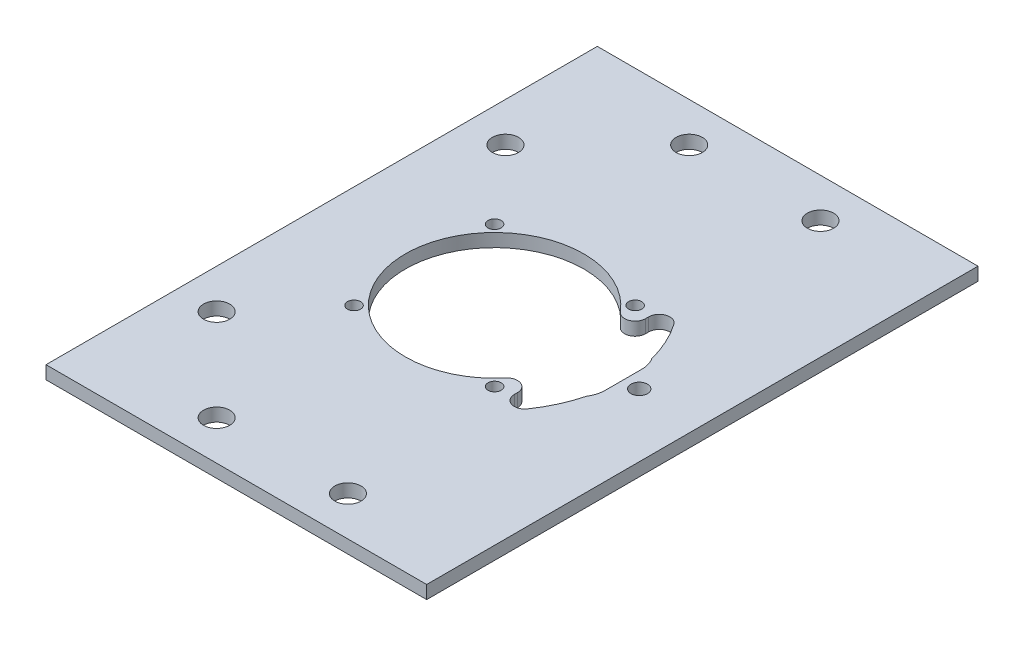
ISO-10303-21;
HEADER;
FILE_DESCRIPTION(('STEP AP214'),'2;1');
FILE_NAME('part.step','',(''),(''),'','','');
FILE_SCHEMA(('AUTOMOTIVE_DESIGN { 1 0 10303 214 1 1 1 1 }'));
ENDSEC;
DATA;
#1=APPLICATION_CONTEXT('core data for automotive mechanical design processes');
#2=APPLICATION_PROTOCOL_DEFINITION('international standard','automotive_design',2000,#1);
#3=PRODUCT_CONTEXT('',#1,'mechanical');
#4=PRODUCT('Part','Part','',(#3));
#5=PRODUCT_RELATED_PRODUCT_CATEGORY('part','',(#4));
#6=PRODUCT_DEFINITION_FORMATION('','',#4);
#7=PRODUCT_DEFINITION_CONTEXT('part definition',#1,'design');
#8=PRODUCT_DEFINITION('design','',#6,#7);
#9=PRODUCT_DEFINITION_SHAPE('','',#8);
#10=(LENGTH_UNIT() NAMED_UNIT(*) SI_UNIT(.MILLI.,.METRE.));
#11=(NAMED_UNIT(*) PLANE_ANGLE_UNIT() SI_UNIT($,.RADIAN.));
#12=(NAMED_UNIT(*) SI_UNIT($,.STERADIAN.) SOLID_ANGLE_UNIT());
#13=UNCERTAINTY_MEASURE_WITH_UNIT(LENGTH_MEASURE(1.E-05),#10,'distance_accuracy_value','');
#14=(GEOMETRIC_REPRESENTATION_CONTEXT(3) GLOBAL_UNCERTAINTY_ASSIGNED_CONTEXT((#13)) GLOBAL_UNIT_ASSIGNED_CONTEXT((#10,
#11,#12)) REPRESENTATION_CONTEXT('',''));
#15=CARTESIAN_POINT('',(0.,0.,0.));
#16=DIRECTION('',(0.,0.,1.));
#17=DIRECTION('',(1.,0.,0.));
#18=AXIS2_PLACEMENT_3D('',#15,#16,#17);
#19=CARTESIAN_POINT('',(0.,3.175,0.));
#20=DIRECTION('',(0.,-1.,0.));
#21=DIRECTION('',(0.,0.,-1.));
#22=AXIS2_PLACEMENT_3D('',#19,#20,#21);
#23=PLANE('',#22);
#24=DIRECTION('',(-0.00543717548561143,0.,0.999985218452122));
#25=VECTOR('',#24,1.);
#26=CARTESIAN_POINT('',(-32.3880138418583,3.175,16.24322424697));
#27=LINE('',#26,#25);
#28=CARTESIAN_POINT('',(-32.3839984355772,3.175,15.5047255654771));
#29=VERTEX_POINT('',#28);
#30=CARTESIAN_POINT('',(-32.3880138418583,3.175,16.24322424697));
#31=VERTEX_POINT('',#30);
#32=EDGE_CURVE('E195',#29,#31,#27,.T.);
#33=ORIENTED_EDGE('',*,*,#32,.F.);
#34=CARTESIAN_POINT('',(-34.9239608904456,3.175,15.4909151397437));
#35=DIRECTION('',(0.,-1.,0.));
#36=DIRECTION('',(0.,0.,-1.));
#37=AXIS2_PLACEMENT_3D('',#34,#35,#36);
#38=CIRCLE('',#37,2.54);
#39=CARTESIAN_POINT('',(-36.8714386914514,3.175,13.8602924934549));
#40=VERTEX_POINT('',#39);
#41=EDGE_CURVE('E445',#29,#40,#38,.F.);
#42=ORIENTED_EDGE('',*,*,#41,.T.);
#43=CARTESIAN_POINT('',(-53.425,3.175,0.));
#44=DIRECTION('',(0.,1.,0.));
#45=DIRECTION('',(0.,0.,1.));
#46=AXIS2_PLACEMENT_3D('',#43,#44,#45);
#47=CIRCLE('',#46,21.59);
#48=CARTESIAN_POINT('',(-36.8714386914514,3.175,-13.8602924934549));
#49=VERTEX_POINT('',#48);
#50=EDGE_CURVE('E375',#49,#40,#47,.T.);
#51=ORIENTED_EDGE('',*,*,#50,.F.);
#52=CARTESIAN_POINT('',(-34.9239608904456,3.175,-15.4909151397437));
#53=DIRECTION('',(0.,-1.,0.));
#54=DIRECTION('',(0.,0.,-1.));
#55=AXIS2_PLACEMENT_3D('',#52,#53,#54);
#56=CIRCLE('',#55,2.54);
#57=CARTESIAN_POINT('',(-32.3839984355773,3.175,-15.5047255654771));
#58=VERTEX_POINT('',#57);
#59=EDGE_CURVE('E442',#49,#58,#56,.F.);
#60=ORIENTED_EDGE('',*,*,#59,.T.);
#61=DIRECTION('',(0.00543717548561203,0.,0.999985218452122));
#62=VECTOR('',#61,1.);
#63=CARTESIAN_POINT('',(-32.3880138418583,3.175,-16.24322424697));
#64=LINE('',#63,#62);
#65=CARTESIAN_POINT('',(-32.3880138418583,3.175,-16.24322424697));
#66=VERTEX_POINT('',#65);
#67=EDGE_CURVE('E189',#66,#58,#64,.T.);
#68=ORIENTED_EDGE('',*,*,#67,.F.);
#69=CARTESIAN_POINT('',(-29.84805138699,3.175,-16.2570346727035));
#70=DIRECTION('',(0.,1.,0.));
#71=DIRECTION('',(0.,0.,1.));
#72=AXIS2_PLACEMENT_3D('',#69,#70,#71);
#73=CIRCLE('',#72,2.54);
#74=CARTESIAN_POINT('',(-27.7569694700933,3.175,-17.698900275604));
#75=VERTEX_POINT('',#74);
#76=EDGE_CURVE('E229',#75,#66,#73,.T.);
#77=ORIENTED_EDGE('',*,*,#76,.F.);
#78=CARTESIAN_POINT('',(-53.425,3.175,0.));
#79=DIRECTION('',(0.,1.,0.));
#80=DIRECTION('',(0.,0.,1.));
#81=AXIS2_PLACEMENT_3D('',#78,#79,#80);
#82=CIRCLE('',#81,31.1785);
#83=CARTESIAN_POINT('',(-23.2293271632066,3.175,-7.76660828053905));
#84=VERTEX_POINT('',#83);
#85=EDGE_CURVE('E225',#84,#75,#82,.T.);
#86=ORIENTED_EDGE('',*,*,#85,.F.);
#87=CARTESIAN_POINT('',(-25.190587694336,3.175,-6.15258934352685));
#88=DIRECTION('',(0.,-1.,0.));
#89=DIRECTION('',(0.,0.,-1.));
#90=AXIS2_PLACEMENT_3D('',#87,#88,#89);
#91=CIRCLE('',#90,2.54);
#92=CARTESIAN_POINT('',(-22.91997949056,3.175,-7.29098223921143));
#93=VERTEX_POINT('',#92);
#94=EDGE_CURVE('E428',#84,#93,#91,.T.);
#95=ORIENTED_EDGE('',*,*,#94,.T.);
#96=CARTESIAN_POINT('',(-28.5965,3.175,-4.44499999999999));
#97=DIRECTION('',(0.,1.,0.));
#98=DIRECTION('',(0.,0.,1.));
#99=AXIS2_PLACEMENT_3D('',#96,#97,#98);
#100=CIRCLE('',#99,6.35);
#101=CARTESIAN_POINT('',(-22.2465,3.175,-4.44499999999999));
#102=VERTEX_POINT('',#101);
#103=EDGE_CURVE('E248',#93,#102,#100,.F.);
#104=ORIENTED_EDGE('',*,*,#103,.T.);
#105=DIRECTION('',(0.,0.,1.));
#106=VECTOR('',#105,1.);
#107=CARTESIAN_POINT('',(-22.2465,3.175,0.));
#108=LINE('',#107,#106);
#109=CARTESIAN_POINT('',(-22.2465,3.175,4.44499999999998));
#110=VERTEX_POINT('',#109);
#111=EDGE_CURVE('E253',#102,#110,#108,.T.);
#112=ORIENTED_EDGE('',*,*,#111,.T.);
#113=CARTESIAN_POINT('',(-28.5965,3.175,4.44499999999998));
#114=DIRECTION('',(0.,1.,0.));
#115=DIRECTION('',(0.,0.,1.));
#116=AXIS2_PLACEMENT_3D('',#113,#114,#115);
#117=CIRCLE('',#116,6.35);
#118=CARTESIAN_POINT('',(-22.91997949056,3.175,7.29098223921142));
#119=VERTEX_POINT('',#118);
#120=EDGE_CURVE('E263',#110,#119,#117,.F.);
#121=ORIENTED_EDGE('',*,*,#120,.T.);
#122=CARTESIAN_POINT('',(-25.190587694336,3.175,6.15258934352686));
#123=DIRECTION('',(0.,-1.,0.));
#124=DIRECTION('',(0.,0.,-1.));
#125=AXIS2_PLACEMENT_3D('',#122,#123,#124);
#126=CIRCLE('',#125,2.54);
#127=CARTESIAN_POINT('',(-23.2293271632066,3.175,7.76660828053907));
#128=VERTEX_POINT('',#127);
#129=EDGE_CURVE('E421',#119,#128,#126,.T.);
#130=ORIENTED_EDGE('',*,*,#129,.T.);
#131=CARTESIAN_POINT('',(-27.7569694700933,3.175,17.698900275604));
#132=VERTEX_POINT('',#131);
#133=EDGE_CURVE('E226',#132,#128,#82,.T.);
#134=ORIENTED_EDGE('',*,*,#133,.F.);
#135=CARTESIAN_POINT('',(-29.8480513869899,3.175,16.2570346727035));
#136=DIRECTION('',(0.,1.,0.));
#137=DIRECTION('',(0.,0.,-1.));
#138=AXIS2_PLACEMENT_3D('',#135,#136,#137);
#139=CIRCLE('',#138,2.54);
#140=EDGE_CURVE('E222',#31,#132,#139,.T.);
#141=ORIENTED_EDGE('',*,*,#140,.F.);
#142=EDGE_LOOP('',(#33,#42,#51,#60,#68,#77,#86,#95,#104,#112,#121,#130,#134,#141));
#143=FACE_BOUND('',#142,.T.);
#144=DIRECTION('',(1.,0.,0.));
#145=VECTOR('',#144,1.);
#146=CARTESIAN_POINT('',(-95.25,3.175,66.675));
#147=LINE('',#146,#145);
#148=CARTESIAN_POINT('',(-95.25,3.175,66.675));
#149=VERTEX_POINT('',#148);
#150=CARTESIAN_POINT('',(-3.17499999999997,3.175,66.675));
#151=VERTEX_POINT('',#150);
#152=EDGE_CURVE('E391',#149,#151,#147,.T.);
#153=ORIENTED_EDGE('',*,*,#152,.T.);
#154=DIRECTION('',(0.,0.,1.));
#155=VECTOR('',#154,1.);
#156=CARTESIAN_POINT('',(-3.17499999999998,3.175,-66.675));
#157=LINE('',#156,#155);
#158=CARTESIAN_POINT('',(-3.17499999999998,3.175,-66.675));
#159=VERTEX_POINT('',#158);
#160=EDGE_CURVE('E321',#159,#151,#157,.T.);
#161=ORIENTED_EDGE('',*,*,#160,.F.);
#162=DIRECTION('',(1.,0.,0.));
#163=VECTOR('',#162,1.);
#164=CARTESIAN_POINT('',(-95.25,3.175,-66.675));
#165=LINE('',#164,#163);
#166=CARTESIAN_POINT('',(-95.25,3.175,-66.675));
#167=VERTEX_POINT('',#166);
#168=EDGE_CURVE('E386',#167,#159,#165,.T.);
#169=ORIENTED_EDGE('',*,*,#168,.F.);
#170=DIRECTION('',(0.,0.,-1.));
#171=VECTOR('',#170,1.);
#172=CARTESIAN_POINT('',(-95.25,3.175,66.675));
#173=LINE('',#172,#171);
#174=EDGE_CURVE('E382',#149,#167,#173,.T.);
#175=ORIENTED_EDGE('',*,*,#174,.F.);
#176=EDGE_LOOP('',(#153,#161,#169,#175));
#177=FACE_BOUND('',#176,.T.);
#178=CARTESIAN_POINT('',(-70.425,3.175,-17.));
#179=DIRECTION('',(0.,1.,0.));
#180=DIRECTION('',(0.,0.,1.));
#181=AXIS2_PLACEMENT_3D('',#178,#179,#180);
#182=CIRCLE('',#181,1.5875);
#183=CARTESIAN_POINT('',(-70.425,3.175,-15.4125));
#184=VERTEX_POINT('',#183);
#185=EDGE_CURVE('E352',#184,#184,#182,.T.);
#186=ORIENTED_EDGE('',*,*,#185,.F.);
#187=EDGE_LOOP('',(#186));
#188=FACE_BOUND('',#187,.T.);
#189=CARTESIAN_POINT('',(-36.425,3.175,-17.));
#190=DIRECTION('',(0.,1.,0.));
#191=DIRECTION('',(0.,0.,1.));
#192=AXIS2_PLACEMENT_3D('',#189,#190,#191);
#193=CIRCLE('',#192,1.5875);
#194=CARTESIAN_POINT('',(-36.425,3.175,-15.4125));
#195=VERTEX_POINT('',#194);
#196=EDGE_CURVE('E347',#195,#195,#193,.T.);
#197=ORIENTED_EDGE('',*,*,#196,.F.);
#198=EDGE_LOOP('',(#197));
#199=FACE_BOUND('',#198,.T.);
#200=CARTESIAN_POINT('',(-36.425,3.175,17.));
#201=DIRECTION('',(0.,1.,0.));
#202=DIRECTION('',(0.,0.,1.));
#203=AXIS2_PLACEMENT_3D('',#200,#201,#202);
#204=CIRCLE('',#203,1.5875);
#205=CARTESIAN_POINT('',(-36.425,3.175,18.5875));
#206=VERTEX_POINT('',#205);
#207=EDGE_CURVE('E348',#206,#206,#204,.T.);
#208=ORIENTED_EDGE('',*,*,#207,.F.);
#209=EDGE_LOOP('',(#208));
#210=FACE_BOUND('',#209,.T.);
#211=CARTESIAN_POINT('',(-70.425,3.175,17.));
#212=DIRECTION('',(0.,1.,0.));
#213=DIRECTION('',(0.,0.,1.));
#214=AXIS2_PLACEMENT_3D('',#211,#212,#213);
#215=CIRCLE('',#214,1.5875);
#216=CARTESIAN_POINT('',(-70.425,3.175,18.5875));
#217=VERTEX_POINT('',#216);
#218=EDGE_CURVE('E357',#217,#217,#215,.T.);
#219=ORIENTED_EDGE('',*,*,#218,.F.);
#220=EDGE_LOOP('',(#219));
#221=FACE_BOUND('',#220,.T.);
#222=CARTESIAN_POINT('',(-18.4365,3.175,0.));
#223=DIRECTION('',(0.,1.,0.));
#224=DIRECTION('',(0.,0.,1.));
#225=AXIS2_PLACEMENT_3D('',#222,#223,#224);
#226=CIRCLE('',#225,2.);
#227=CARTESIAN_POINT('',(-18.4365,3.175,2.));
#228=VERTEX_POINT('',#227);
#229=EDGE_CURVE('E335',#228,#228,#226,.T.);
#230=ORIENTED_EDGE('',*,*,#229,.F.);
#231=EDGE_LOOP('',(#230));
#232=FACE_BOUND('',#231,.T.);
#233=CARTESIAN_POINT('',(-63.5,3.175,57.15));
#234=DIRECTION('',(0.,1.,0.));
#235=DIRECTION('',(0.,0.,1.));
#236=AXIS2_PLACEMENT_3D('',#233,#234,#235);
#237=CIRCLE('',#236,3.175);
#238=CARTESIAN_POINT('',(-63.5,3.175,60.325));
#239=VERTEX_POINT('',#238);
#240=EDGE_CURVE('E289',#239,#239,#237,.T.);
#241=ORIENTED_EDGE('',*,*,#240,.F.);
#242=EDGE_LOOP('',(#241));
#243=FACE_BOUND('',#242,.T.);
#244=CARTESIAN_POINT('',(-63.5,3.175,-57.15));
#245=DIRECTION('',(0.,1.,0.));
#246=DIRECTION('',(0.,0.,-1.));
#247=AXIS2_PLACEMENT_3D('',#244,#245,#246);
#248=CIRCLE('',#247,3.175);
#249=CARTESIAN_POINT('',(-63.5,3.175,-60.325));
#250=VERTEX_POINT('',#249);
#251=EDGE_CURVE('E277',#250,#250,#248,.T.);
#252=ORIENTED_EDGE('',*,*,#251,.F.);
#253=EDGE_LOOP('',(#252));
#254=FACE_BOUND('',#253,.T.);
#255=CARTESIAN_POINT('',(-31.75,3.175,-57.15));
#256=DIRECTION('',(0.,1.,0.));
#257=DIRECTION('',(0.,0.,-1.));
#258=AXIS2_PLACEMENT_3D('',#255,#256,#257);
#259=CIRCLE('',#258,3.175);
#260=CARTESIAN_POINT('',(-31.75,3.175,-60.325));
#261=VERTEX_POINT('',#260);
#262=EDGE_CURVE('E310',#261,#261,#259,.T.);
#263=ORIENTED_EDGE('',*,*,#262,.F.);
#264=EDGE_LOOP('',(#263));
#265=FACE_BOUND('',#264,.T.);
#266=CARTESIAN_POINT('',(-85.725,3.175,-34.925));
#267=DIRECTION('',(0.,1.,0.));
#268=DIRECTION('',(0.,0.,-1.));
#269=AXIS2_PLACEMENT_3D('',#266,#267,#268);
#270=CIRCLE('',#269,3.175);
#271=CARTESIAN_POINT('',(-85.725,3.175,-38.1));
#272=VERTEX_POINT('',#271);
#273=EDGE_CURVE('E302',#272,#272,#270,.T.);
#274=ORIENTED_EDGE('',*,*,#273,.F.);
#275=EDGE_LOOP('',(#274));
#276=FACE_BOUND('',#275,.T.);
#277=CARTESIAN_POINT('',(-85.725,3.175,34.925));
#278=DIRECTION('',(0.,1.,0.));
#279=DIRECTION('',(0.,0.,1.));
#280=AXIS2_PLACEMENT_3D('',#277,#278,#279);
#281=CIRCLE('',#280,3.175);
#282=CARTESIAN_POINT('',(-85.725,3.175,38.1));
#283=VERTEX_POINT('',#282);
#284=EDGE_CURVE('E294',#283,#283,#281,.T.);
#285=ORIENTED_EDGE('',*,*,#284,.F.);
#286=EDGE_LOOP('',(#285));
#287=FACE_BOUND('',#286,.T.);
#288=CARTESIAN_POINT('',(-31.75,3.175,57.15));
#289=DIRECTION('',(0.,1.,0.));
#290=DIRECTION('',(0.,0.,1.));
#291=AXIS2_PLACEMENT_3D('',#288,#289,#290);
#292=CIRCLE('',#291,3.175);
#293=CARTESIAN_POINT('',(-31.75,3.175,60.325));
#294=VERTEX_POINT('',#293);
#295=EDGE_CURVE('E285',#294,#294,#292,.T.);
#296=ORIENTED_EDGE('',*,*,#295,.F.);
#297=EDGE_LOOP('',(#296));
#298=FACE_BOUND('',#297,.T.);
#299=ADVANCED_FACE('F49',(#143,#177,#188,#199,#210,#221,#232,#243,#254,#265,#276,#287,#298),#23,.F.);
#300=CARTESIAN_POINT('',(0.,0.,0.));
#301=DIRECTION('',(0.,-1.,0.));
#302=DIRECTION('',(0.,0.,-1.));
#303=AXIS2_PLACEMENT_3D('',#300,#301,#302);
#304=PLANE('',#303);
#305=CARTESIAN_POINT('',(-53.425,0.,0.));
#306=DIRECTION('',(0.,1.,0.));
#307=DIRECTION('',(0.,0.,1.));
#308=AXIS2_PLACEMENT_3D('',#305,#306,#307);
#309=CIRCLE('',#308,21.59);
#310=CARTESIAN_POINT('',(-36.8714386914514,0.,-13.8602924934549));
#311=VERTEX_POINT('',#310);
#312=CARTESIAN_POINT('',(-36.8714386914514,0.,13.8602924934549));
#313=VERTEX_POINT('',#312);
#314=EDGE_CURVE('E376',#311,#313,#309,.T.);
#315=ORIENTED_EDGE('',*,*,#314,.T.);
#316=CARTESIAN_POINT('',(-34.9239608904456,0.,15.4909151397437));
#317=DIRECTION('',(0.,-1.,0.));
#318=DIRECTION('',(0.,0.,-1.));
#319=AXIS2_PLACEMENT_3D('',#316,#317,#318);
#320=CIRCLE('',#319,2.54);
#321=CARTESIAN_POINT('',(-32.3839984355772,0.,15.5047255654771));
#322=VERTEX_POINT('',#321);
#323=EDGE_CURVE('E58',#313,#322,#320,.T.);
#324=ORIENTED_EDGE('',*,*,#323,.T.);
#325=DIRECTION('',(-0.00543717548561143,0.,0.999985218452122));
#326=VECTOR('',#325,1.);
#327=CARTESIAN_POINT('',(-32.3880138418583,0.,16.24322424697));
#328=LINE('',#327,#326);
#329=CARTESIAN_POINT('',(-32.3880138418583,0.,16.24322424697));
#330=VERTEX_POINT('',#329);
#331=EDGE_CURVE('E177',#322,#330,#328,.T.);
#332=ORIENTED_EDGE('',*,*,#331,.T.);
#333=CARTESIAN_POINT('',(-29.8480513869899,0.,16.2570346727035));
#334=DIRECTION('',(0.,1.,0.));
#335=DIRECTION('',(0.,0.,-1.));
#336=AXIS2_PLACEMENT_3D('',#333,#334,#335);
#337=CIRCLE('',#336,2.54);
#338=CARTESIAN_POINT('',(-27.7569694700933,0.,17.698900275604));
#339=VERTEX_POINT('',#338);
#340=EDGE_CURVE('E183',#330,#339,#337,.T.);
#341=ORIENTED_EDGE('',*,*,#340,.T.);
#342=CARTESIAN_POINT('',(-53.425,0.,0.));
#343=DIRECTION('',(0.,1.,0.));
#344=DIRECTION('',(0.,0.,1.));
#345=AXIS2_PLACEMENT_3D('',#342,#343,#344);
#346=CIRCLE('',#345,31.1785);
#347=CARTESIAN_POINT('',(-23.2293271632066,0.,7.76660828053905));
#348=VERTEX_POINT('',#347);
#349=EDGE_CURVE('E210',#339,#348,#346,.T.);
#350=ORIENTED_EDGE('',*,*,#349,.T.);
#351=CARTESIAN_POINT('',(-25.190587694336,0.,6.15258934352686));
#352=DIRECTION('',(0.,-1.,0.));
#353=DIRECTION('',(0.,0.,-1.));
#354=AXIS2_PLACEMENT_3D('',#351,#352,#353);
#355=CIRCLE('',#354,2.54);
#356=CARTESIAN_POINT('',(-22.91997949056,0.,7.29098223921142));
#357=VERTEX_POINT('',#356);
#358=EDGE_CURVE('E425',#348,#357,#355,.F.);
#359=ORIENTED_EDGE('',*,*,#358,.T.);
#360=CARTESIAN_POINT('',(-28.5965,0.,4.44499999999998));
#361=DIRECTION('',(0.,1.,0.));
#362=DIRECTION('',(0.,0.,1.));
#363=AXIS2_PLACEMENT_3D('',#360,#361,#362);
#364=CIRCLE('',#363,6.35);
#365=CARTESIAN_POINT('',(-22.2465,0.,4.44499999999998));
#366=VERTEX_POINT('',#365);
#367=EDGE_CURVE('E252',#366,#357,#364,.F.);
#368=ORIENTED_EDGE('',*,*,#367,.F.);
#369=DIRECTION('',(0.,0.,1.));
#370=VECTOR('',#369,1.);
#371=CARTESIAN_POINT('',(-22.2465,0.,0.));
#372=LINE('',#371,#370);
#373=CARTESIAN_POINT('',(-22.2465,0.,-4.44499999999999));
#374=VERTEX_POINT('',#373);
#375=EDGE_CURVE('E257',#374,#366,#372,.T.);
#376=ORIENTED_EDGE('',*,*,#375,.F.);
#377=CARTESIAN_POINT('',(-28.5965,0.,-4.44499999999999));
#378=DIRECTION('',(0.,1.,0.));
#379=DIRECTION('',(0.,0.,1.));
#380=AXIS2_PLACEMENT_3D('',#377,#378,#379);
#381=CIRCLE('',#380,6.35);
#382=CARTESIAN_POINT('',(-22.91997949056,0.,-7.29098223921143));
#383=VERTEX_POINT('',#382);
#384=EDGE_CURVE('E249',#383,#374,#381,.F.);
#385=ORIENTED_EDGE('',*,*,#384,.F.);
#386=CARTESIAN_POINT('',(-25.190587694336,0.,-6.15258934352685));
#387=DIRECTION('',(0.,-1.,0.));
#388=DIRECTION('',(0.,0.,-1.));
#389=AXIS2_PLACEMENT_3D('',#386,#387,#388);
#390=CIRCLE('',#389,2.54);
#391=CARTESIAN_POINT('',(-23.2293271632066,0.,-7.76660828053905));
#392=VERTEX_POINT('',#391);
#393=EDGE_CURVE('E431',#383,#392,#390,.F.);
#394=ORIENTED_EDGE('',*,*,#393,.T.);
#395=CARTESIAN_POINT('',(-27.7569694700933,0.,-17.698900275604));
#396=VERTEX_POINT('',#395);
#397=EDGE_CURVE('E206',#392,#396,#346,.T.);
#398=ORIENTED_EDGE('',*,*,#397,.T.);
#399=CARTESIAN_POINT('',(-29.84805138699,0.,-16.2570346727035));
#400=DIRECTION('',(0.,1.,0.));
#401=DIRECTION('',(0.,0.,1.));
#402=AXIS2_PLACEMENT_3D('',#399,#400,#401);
#403=CIRCLE('',#402,2.54);
#404=CARTESIAN_POINT('',(-32.3880138418583,0.,-16.24322424697));
#405=VERTEX_POINT('',#404);
#406=EDGE_CURVE('E214',#396,#405,#403,.T.);
#407=ORIENTED_EDGE('',*,*,#406,.T.);
#408=DIRECTION('',(0.00543717548561203,0.,0.999985218452122));
#409=VECTOR('',#408,1.);
#410=CARTESIAN_POINT('',(-32.3880138418583,0.,-16.24322424697));
#411=LINE('',#410,#409);
#412=CARTESIAN_POINT('',(-32.3839984355773,0.,-15.5047255654771));
#413=VERTEX_POINT('',#412);
#414=EDGE_CURVE('E201',#405,#413,#411,.T.);
#415=ORIENTED_EDGE('',*,*,#414,.T.);
#416=CARTESIAN_POINT('',(-34.9239608904456,0.,-15.4909151397437));
#417=DIRECTION('',(0.,-1.,0.));
#418=DIRECTION('',(0.,0.,-1.));
#419=AXIS2_PLACEMENT_3D('',#416,#417,#418);
#420=CIRCLE('',#419,2.54);
#421=EDGE_CURVE('E454',#413,#311,#420,.T.);
#422=ORIENTED_EDGE('',*,*,#421,.T.);
#423=EDGE_LOOP('',(#315,#324,#332,#341,#350,#359,#368,#376,#385,#394,#398,#407,#415,#422));
#424=FACE_BOUND('',#423,.T.);
#425=CARTESIAN_POINT('',(-31.75,0.,57.15));
#426=DIRECTION('',(0.,1.,0.));
#427=DIRECTION('',(0.,0.,1.));
#428=AXIS2_PLACEMENT_3D('',#425,#426,#427);
#429=CIRCLE('',#428,3.175);
#430=CARTESIAN_POINT('',(-31.75,0.,60.325));
#431=VERTEX_POINT('',#430);
#432=EDGE_CURVE('E290',#431,#431,#429,.T.);
#433=ORIENTED_EDGE('',*,*,#432,.T.);
#434=EDGE_LOOP('',(#433));
#435=FACE_BOUND('',#434,.T.);
#436=CARTESIAN_POINT('',(-85.725,0.,34.925));
#437=DIRECTION('',(0.,1.,0.));
#438=DIRECTION('',(0.,0.,1.));
#439=AXIS2_PLACEMENT_3D('',#436,#437,#438);
#440=CIRCLE('',#439,3.175);
#441=CARTESIAN_POINT('',(-85.725,0.,38.1));
#442=VERTEX_POINT('',#441);
#443=EDGE_CURVE('E298',#442,#442,#440,.T.);
#444=ORIENTED_EDGE('',*,*,#443,.T.);
#445=EDGE_LOOP('',(#444));
#446=FACE_BOUND('',#445,.T.);
#447=CARTESIAN_POINT('',(-85.725,0.,-34.925));
#448=DIRECTION('',(0.,1.,0.));
#449=DIRECTION('',(0.,0.,-1.));
#450=AXIS2_PLACEMENT_3D('',#447,#448,#449);
#451=CIRCLE('',#450,3.175);
#452=CARTESIAN_POINT('',(-85.725,0.,-38.1));
#453=VERTEX_POINT('',#452);
#454=EDGE_CURVE('E306',#453,#453,#451,.T.);
#455=ORIENTED_EDGE('',*,*,#454,.T.);
#456=EDGE_LOOP('',(#455));
#457=FACE_BOUND('',#456,.T.);
#458=CARTESIAN_POINT('',(-31.75,0.,-57.15));
#459=DIRECTION('',(0.,1.,0.));
#460=DIRECTION('',(0.,0.,-1.));
#461=AXIS2_PLACEMENT_3D('',#458,#459,#460);
#462=CIRCLE('',#461,3.175);
#463=CARTESIAN_POINT('',(-31.75,0.,-60.325));
#464=VERTEX_POINT('',#463);
#465=EDGE_CURVE('E281',#464,#464,#462,.T.);
#466=ORIENTED_EDGE('',*,*,#465,.T.);
#467=EDGE_LOOP('',(#466));
#468=FACE_BOUND('',#467,.T.);
#469=CARTESIAN_POINT('',(-63.5,0.,-57.15));
#470=DIRECTION('',(0.,1.,0.));
#471=DIRECTION('',(0.,0.,-1.));
#472=AXIS2_PLACEMENT_3D('',#469,#470,#471);
#473=CIRCLE('',#472,3.175);
#474=CARTESIAN_POINT('',(-63.5,0.,-60.325));
#475=VERTEX_POINT('',#474);
#476=EDGE_CURVE('E273',#475,#475,#473,.T.);
#477=ORIENTED_EDGE('',*,*,#476,.T.);
#478=EDGE_LOOP('',(#477));
#479=FACE_BOUND('',#478,.T.);
#480=CARTESIAN_POINT('',(-63.5,0.,57.15));
#481=DIRECTION('',(0.,1.,0.));
#482=DIRECTION('',(0.,0.,1.));
#483=AXIS2_PLACEMENT_3D('',#480,#481,#482);
#484=CIRCLE('',#483,3.175);
#485=CARTESIAN_POINT('',(-63.5,0.,60.325));
#486=VERTEX_POINT('',#485);
#487=EDGE_CURVE('E317',#486,#486,#484,.T.);
#488=ORIENTED_EDGE('',*,*,#487,.T.);
#489=EDGE_LOOP('',(#488));
#490=FACE_BOUND('',#489,.T.);
#491=DIRECTION('',(0.,0.,1.));
#492=VECTOR('',#491,1.);
#493=CARTESIAN_POINT('',(-3.17499999999998,0.,-66.675));
#494=LINE('',#493,#492);
#495=CARTESIAN_POINT('',(-3.17499999999998,0.,-66.675));
#496=VERTEX_POINT('',#495);
#497=CARTESIAN_POINT('',(-3.17499999999997,0.,66.675));
#498=VERTEX_POINT('',#497);
#499=EDGE_CURVE('E325',#496,#498,#494,.T.);
#500=ORIENTED_EDGE('',*,*,#499,.T.);
#501=DIRECTION('',(1.,0.,0.));
#502=VECTOR('',#501,1.);
#503=CARTESIAN_POINT('',(-95.25,0.,66.675));
#504=LINE('',#503,#502);
#505=CARTESIAN_POINT('',(-95.25,0.,66.675));
#506=VERTEX_POINT('',#505);
#507=EDGE_CURVE('E387',#506,#498,#504,.T.);
#508=ORIENTED_EDGE('',*,*,#507,.F.);
#509=DIRECTION('',(0.,0.,-1.));
#510=VECTOR('',#509,1.);
#511=CARTESIAN_POINT('',(-95.25,0.,66.675));
#512=LINE('',#511,#510);
#513=CARTESIAN_POINT('',(-95.25,0.,-66.675));
#514=VERTEX_POINT('',#513);
#515=EDGE_CURVE('E379',#506,#514,#512,.T.);
#516=ORIENTED_EDGE('',*,*,#515,.T.);
#517=DIRECTION('',(1.,0.,0.));
#518=VECTOR('',#517,1.);
#519=CARTESIAN_POINT('',(-95.25,0.,-66.675));
#520=LINE('',#519,#518);
#521=EDGE_CURVE('E399',#514,#496,#520,.T.);
#522=ORIENTED_EDGE('',*,*,#521,.T.);
#523=EDGE_LOOP('',(#500,#508,#516,#522));
#524=FACE_BOUND('',#523,.T.);
#525=CARTESIAN_POINT('',(-18.4365,0.,0.));
#526=DIRECTION('',(0.,-1.,0.));
#527=DIRECTION('',(0.,0.,-1.));
#528=AXIS2_PLACEMENT_3D('',#525,#526,#527);
#529=CIRCLE('',#528,2.);
#530=CARTESIAN_POINT('',(-18.4365,0.,-2.));
#531=VERTEX_POINT('',#530);
#532=EDGE_CURVE('E342',#531,#531,#529,.T.);
#533=ORIENTED_EDGE('',*,*,#532,.F.);
#534=EDGE_LOOP('',(#533));
#535=FACE_BOUND('',#534,.T.);
#536=CARTESIAN_POINT('',(-70.425,0.,17.));
#537=DIRECTION('',(0.,-1.,0.));
#538=DIRECTION('',(0.,0.,-1.));
#539=AXIS2_PLACEMENT_3D('',#536,#537,#538);
#540=CIRCLE('',#539,1.5875);
#541=CARTESIAN_POINT('',(-70.425,0.,15.4125));
#542=VERTEX_POINT('',#541);
#543=EDGE_CURVE('E361',#542,#542,#540,.F.);
#544=ORIENTED_EDGE('',*,*,#543,.T.);
#545=EDGE_LOOP('',(#544));
#546=FACE_BOUND('',#545,.T.);
#547=CARTESIAN_POINT('',(-36.425,0.,17.));
#548=DIRECTION('',(0.,-1.,0.));
#549=DIRECTION('',(0.,0.,-1.));
#550=AXIS2_PLACEMENT_3D('',#547,#548,#549);
#551=CIRCLE('',#550,1.5875);
#552=CARTESIAN_POINT('',(-36.425,0.,15.4125));
#553=VERTEX_POINT('',#552);
#554=EDGE_CURVE('E353',#553,#553,#551,.F.);
#555=ORIENTED_EDGE('',*,*,#554,.T.);
#556=EDGE_LOOP('',(#555));
#557=FACE_BOUND('',#556,.T.);
#558=CARTESIAN_POINT('',(-36.425,0.,-17.));
#559=DIRECTION('',(0.,-1.,0.));
#560=DIRECTION('',(0.,0.,-1.));
#561=AXIS2_PLACEMENT_3D('',#558,#559,#560);
#562=CIRCLE('',#561,1.5875);
#563=CARTESIAN_POINT('',(-36.425,0.,-18.5875));
#564=VERTEX_POINT('',#563);
#565=EDGE_CURVE('E343',#564,#564,#562,.F.);
#566=ORIENTED_EDGE('',*,*,#565,.T.);
#567=EDGE_LOOP('',(#566));
#568=FACE_BOUND('',#567,.T.);
#569=CARTESIAN_POINT('',(-70.425,0.,-17.));
#570=DIRECTION('',(0.,-1.,0.));
#571=DIRECTION('',(0.,0.,-1.));
#572=AXIS2_PLACEMENT_3D('',#569,#570,#571);
#573=CIRCLE('',#572,1.5875);
#574=CARTESIAN_POINT('',(-70.425,0.,-18.5875));
#575=VERTEX_POINT('',#574);
#576=EDGE_CURVE('E371',#575,#575,#573,.F.);
#577=ORIENTED_EDGE('',*,*,#576,.T.);
#578=EDGE_LOOP('',(#577));
#579=FACE_BOUND('',#578,.T.);
#580=ADVANCED_FACE('F179',(#424,#435,#446,#457,#468,#479,#490,#524,#535,#546,#557,#568,#579),
#304,.T.);
#581=CARTESIAN_POINT('',(-53.425,0.,0.));
#582=DIRECTION('',(0.,1.,0.));
#583=DIRECTION('',(0.,0.,1.));
#584=AXIS2_PLACEMENT_3D('',#581,#582,#583);
#585=CYLINDRICAL_SURFACE('',#584,21.59);
#586=ORIENTED_EDGE('',*,*,#50,.T.);
#587=DIRECTION('',(0.,1.,0.));
#588=VECTOR('',#587,1.);
#589=CARTESIAN_POINT('',(-36.8714386914514,0.,13.8602924934549));
#590=LINE('',#589,#588);
#591=EDGE_CURVE('E71',#40,#313,#590,.F.);
#592=ORIENTED_EDGE('',*,*,#591,.T.);
#593=ORIENTED_EDGE('',*,*,#314,.F.);
#594=DIRECTION('',(0.,1.,0.));
#595=VECTOR('',#594,1.);
#596=CARTESIAN_POINT('',(-36.8714386914514,0.,-13.8602924934549));
#597=LINE('',#596,#595);
#598=EDGE_CURVE('E448',#311,#49,#597,.T.);
#599=ORIENTED_EDGE('',*,*,#598,.T.);
#600=EDGE_LOOP('',(#586,#592,#593,#599));
#601=FACE_BOUND('',#600,.T.);
#602=ADVANCED_FACE('F460',(#601),#585,.F.);
#603=CARTESIAN_POINT('',(-95.25,3.175,66.675));
#604=DIRECTION('',(-1.,0.,0.));
#605=DIRECTION('',(0.,0.,1.));
#606=AXIS2_PLACEMENT_3D('',#603,#604,#605);
#607=PLANE('',#606);
#608=ORIENTED_EDGE('',*,*,#515,.F.);
#609=DIRECTION('',(0.,-1.,0.));
#610=VECTOR('',#609,1.);
#611=CARTESIAN_POINT('',(-95.25,3.175,66.675));
#612=LINE('',#611,#610);
#613=EDGE_CURVE('E406',#149,#506,#612,.T.);
#614=ORIENTED_EDGE('',*,*,#613,.F.);
#615=ORIENTED_EDGE('',*,*,#174,.T.);
#616=DIRECTION('',(0.,-1.,0.));
#617=VECTOR('',#616,1.);
#618=CARTESIAN_POINT('',(-95.25,3.175,-66.675));
#619=LINE('',#618,#617);
#620=EDGE_CURVE('E395',#167,#514,#619,.T.);
#621=ORIENTED_EDGE('',*,*,#620,.T.);
#622=EDGE_LOOP('',(#608,#614,#615,#621));
#623=FACE_BOUND('',#622,.T.);
#624=ADVANCED_FACE('F521',(#623),#607,.T.);
#625=CARTESIAN_POINT('',(-95.25,3.175,66.675));
#626=DIRECTION('',(0.,0.,-1.));
#627=DIRECTION('',(-1.,0.,0.));
#628=AXIS2_PLACEMENT_3D('',#625,#626,#627);
#629=PLANE('',#628);
#630=ORIENTED_EDGE('',*,*,#507,.T.);
#631=DIRECTION('',(0.,1.,0.));
#632=VECTOR('',#631,1.);
#633=CARTESIAN_POINT('',(-3.17499999999997,0.,66.675));
#634=LINE('',#633,#632);
#635=EDGE_CURVE('E329',#498,#151,#634,.T.);
#636=ORIENTED_EDGE('',*,*,#635,.T.);
#637=ORIENTED_EDGE('',*,*,#152,.F.);
#638=ORIENTED_EDGE('',*,*,#613,.T.);
#639=EDGE_LOOP('',(#630,#636,#637,#638));
#640=FACE_BOUND('',#639,.T.);
#641=ADVANCED_FACE('F517',(#640),#629,.F.);
#642=CARTESIAN_POINT('',(-95.25,3.175,-66.675));
#643=DIRECTION('',(0.,0.,-1.));
#644=DIRECTION('',(-1.,0.,0.));
#645=AXIS2_PLACEMENT_3D('',#642,#643,#644);
#646=PLANE('',#645);
#647=DIRECTION('',(0.,1.,0.));
#648=VECTOR('',#647,1.);
#649=CARTESIAN_POINT('',(-3.17499999999998,0.,-66.675));
#650=LINE('',#649,#648);
#651=EDGE_CURVE('E332',#496,#159,#650,.T.);
#652=ORIENTED_EDGE('',*,*,#651,.F.);
#653=ORIENTED_EDGE('',*,*,#521,.F.);
#654=ORIENTED_EDGE('',*,*,#620,.F.);
#655=ORIENTED_EDGE('',*,*,#168,.T.);
#656=EDGE_LOOP('',(#652,#653,#654,#655));
#657=FACE_BOUND('',#656,.T.);
#658=ADVANCED_FACE('F520',(#657),#646,.T.);
#659=CARTESIAN_POINT('',(-70.425,-4.49012806053458,-17.));
#660=DIRECTION('',(0.,1.,0.));
#661=DIRECTION('',(0.,0.,1.));
#662=AXIS2_PLACEMENT_3D('',#659,#660,#661);
#663=CYLINDRICAL_SURFACE('',#662,1.5875);
#664=ORIENTED_EDGE('',*,*,#185,.T.);
#665=EDGE_LOOP('',(#664));
#666=FACE_BOUND('',#665,.T.);
#667=ORIENTED_EDGE('',*,*,#576,.F.);
#668=EDGE_LOOP('',(#667));
#669=FACE_BOUND('',#668,.T.);
#670=ADVANCED_FACE('F525',(#666,#669),#663,.F.);
#671=CARTESIAN_POINT('',(-36.425,-4.49012806053458,-17.));
#672=DIRECTION('',(0.,1.,0.));
#673=DIRECTION('',(0.,0.,1.));
#674=AXIS2_PLACEMENT_3D('',#671,#672,#673);
#675=CYLINDRICAL_SURFACE('',#674,1.5875);
#676=ORIENTED_EDGE('',*,*,#196,.T.);
#677=EDGE_LOOP('',(#676));
#678=FACE_BOUND('',#677,.T.);
#679=ORIENTED_EDGE('',*,*,#565,.F.);
#680=EDGE_LOOP('',(#679));
#681=FACE_BOUND('',#680,.T.);
#682=ADVANCED_FACE('F587',(#678,#681),#675,.F.);
#683=CARTESIAN_POINT('',(-36.425,-4.49012806053458,17.));
#684=DIRECTION('',(0.,1.,0.));
#685=DIRECTION('',(0.,0.,1.));
#686=AXIS2_PLACEMENT_3D('',#683,#684,#685);
#687=CYLINDRICAL_SURFACE('',#686,1.5875);
#688=ORIENTED_EDGE('',*,*,#207,.T.);
#689=EDGE_LOOP('',(#688));
#690=FACE_BOUND('',#689,.T.);
#691=ORIENTED_EDGE('',*,*,#554,.F.);
#692=EDGE_LOOP('',(#691));
#693=FACE_BOUND('',#692,.T.);
#694=ADVANCED_FACE('F590',(#690,#693),#687,.F.);
#695=CARTESIAN_POINT('',(-70.425,-4.49012806053458,17.));
#696=DIRECTION('',(0.,1.,0.));
#697=DIRECTION('',(0.,0.,1.));
#698=AXIS2_PLACEMENT_3D('',#695,#696,#697);
#699=CYLINDRICAL_SURFACE('',#698,1.5875);
#700=ORIENTED_EDGE('',*,*,#218,.T.);
#701=EDGE_LOOP('',(#700));
#702=FACE_BOUND('',#701,.T.);
#703=ORIENTED_EDGE('',*,*,#543,.F.);
#704=EDGE_LOOP('',(#703));
#705=FACE_BOUND('',#704,.T.);
#706=ADVANCED_FACE('F585',(#702,#705),#699,.F.);
#707=CARTESIAN_POINT('',(-18.4365,-6.825,0.));
#708=DIRECTION('',(0.,1.,0.));
#709=DIRECTION('',(0.,0.,1.));
#710=AXIS2_PLACEMENT_3D('',#707,#708,#709);
#711=CYLINDRICAL_SURFACE('',#710,2.);
#712=ORIENTED_EDGE('',*,*,#532,.T.);
#713=EDGE_LOOP('',(#712));
#714=FACE_BOUND('',#713,.T.);
#715=ORIENTED_EDGE('',*,*,#229,.T.);
#716=EDGE_LOOP('',(#715));
#717=FACE_BOUND('',#716,.T.);
#718=ADVANCED_FACE('F581',(#714,#717),#711,.F.);
#719=CARTESIAN_POINT('',(-3.17499999999998,0.,-66.675));
#720=DIRECTION('',(-1.,0.,0.));
#721=DIRECTION('',(0.,0.,1.));
#722=AXIS2_PLACEMENT_3D('',#719,#720,#721);
#723=PLANE('',#722);
#724=ORIENTED_EDGE('',*,*,#160,.T.);
#725=ORIENTED_EDGE('',*,*,#635,.F.);
#726=ORIENTED_EDGE('',*,*,#499,.F.);
#727=ORIENTED_EDGE('',*,*,#651,.T.);
#728=EDGE_LOOP('',(#724,#725,#726,#727));
#729=FACE_BOUND('',#728,.T.);
#730=ADVANCED_FACE('F577',(#729),#723,.F.);
#731=CARTESIAN_POINT('',(-63.5,0.,57.15));
#732=DIRECTION('',(0.,1.,0.));
#733=DIRECTION('',(0.,0.,1.));
#734=AXIS2_PLACEMENT_3D('',#731,#732,#733);
#735=CYLINDRICAL_SURFACE('',#734,3.175);
#736=ORIENTED_EDGE('',*,*,#487,.F.);
#737=EDGE_LOOP('',(#736));
#738=FACE_BOUND('',#737,.T.);
#739=ORIENTED_EDGE('',*,*,#240,.T.);
#740=EDGE_LOOP('',(#739));
#741=FACE_BOUND('',#740,.T.);
#742=ADVANCED_FACE('F559',(#738,#741),#735,.F.);
#743=CARTESIAN_POINT('',(-63.5,0.,-57.15));
#744=DIRECTION('',(0.,1.,0.));
#745=DIRECTION('',(0.,0.,1.));
#746=AXIS2_PLACEMENT_3D('',#743,#744,#745);
#747=CYLINDRICAL_SURFACE('',#746,3.175);
#748=ORIENTED_EDGE('',*,*,#476,.F.);
#749=EDGE_LOOP('',(#748));
#750=FACE_BOUND('',#749,.T.);
#751=ORIENTED_EDGE('',*,*,#251,.T.);
#752=EDGE_LOOP('',(#751));
#753=FACE_BOUND('',#752,.T.);
#754=ADVANCED_FACE('F555',(#750,#753),#747,.F.);
#755=CARTESIAN_POINT('',(-31.75,0.,-57.15));
#756=DIRECTION('',(0.,1.,0.));
#757=DIRECTION('',(0.,0.,1.));
#758=AXIS2_PLACEMENT_3D('',#755,#756,#757);
#759=CYLINDRICAL_SURFACE('',#758,3.175);
#760=ORIENTED_EDGE('',*,*,#465,.F.);
#761=EDGE_LOOP('',(#760));
#762=FACE_BOUND('',#761,.T.);
#763=ORIENTED_EDGE('',*,*,#262,.T.);
#764=EDGE_LOOP('',(#763));
#765=FACE_BOUND('',#764,.T.);
#766=ADVANCED_FACE('F558',(#762,#765),#759,.F.);
#767=CARTESIAN_POINT('',(-85.725,0.,-34.925));
#768=DIRECTION('',(0.,1.,0.));
#769=DIRECTION('',(0.,0.,1.));
#770=AXIS2_PLACEMENT_3D('',#767,#768,#769);
#771=CYLINDRICAL_SURFACE('',#770,3.175);
#772=ORIENTED_EDGE('',*,*,#454,.F.);
#773=EDGE_LOOP('',(#772));
#774=FACE_BOUND('',#773,.T.);
#775=ORIENTED_EDGE('',*,*,#273,.T.);
#776=EDGE_LOOP('',(#775));
#777=FACE_BOUND('',#776,.T.);
#778=ADVANCED_FACE('F567',(#774,#777),#771,.F.);
#779=CARTESIAN_POINT('',(-85.725,0.,34.925));
#780=DIRECTION('',(0.,1.,0.));
#781=DIRECTION('',(0.,0.,1.));
#782=AXIS2_PLACEMENT_3D('',#779,#780,#781);
#783=CYLINDRICAL_SURFACE('',#782,3.175);
#784=ORIENTED_EDGE('',*,*,#443,.F.);
#785=EDGE_LOOP('',(#784));
#786=FACE_BOUND('',#785,.T.);
#787=ORIENTED_EDGE('',*,*,#284,.T.);
#788=EDGE_LOOP('',(#787));
#789=FACE_BOUND('',#788,.T.);
#790=ADVANCED_FACE('F563',(#786,#789),#783,.F.);
#791=CARTESIAN_POINT('',(-31.75,0.,57.15));
#792=DIRECTION('',(0.,1.,0.));
#793=DIRECTION('',(0.,0.,1.));
#794=AXIS2_PLACEMENT_3D('',#791,#792,#793);
#795=CYLINDRICAL_SURFACE('',#794,3.175);
#796=ORIENTED_EDGE('',*,*,#432,.F.);
#797=EDGE_LOOP('',(#796));
#798=FACE_BOUND('',#797,.T.);
#799=ORIENTED_EDGE('',*,*,#295,.T.);
#800=EDGE_LOOP('',(#799));
#801=FACE_BOUND('',#800,.T.);
#802=ADVANCED_FACE('F554',(#798,#801),#795,.F.);
#803=CARTESIAN_POINT('',(-28.5965,0.,-4.44499999999999));
#804=DIRECTION('',(0.,1.,0.));
#805=DIRECTION('',(0.,0.,1.));
#806=AXIS2_PLACEMENT_3D('',#803,#804,#805);
#807=CYLINDRICAL_SURFACE('',#806,6.35);
#808=ORIENTED_EDGE('',*,*,#103,.F.);
#809=DIRECTION('',(0.,1.,0.));
#810=VECTOR('',#809,1.);
#811=CARTESIAN_POINT('',(-22.91997949056,0.,-7.29098223921143));
#812=LINE('',#811,#810);
#813=EDGE_CURVE('E418',#93,#383,#812,.F.);
#814=ORIENTED_EDGE('',*,*,#813,.T.);
#815=ORIENTED_EDGE('',*,*,#384,.T.);
#816=DIRECTION('',(0.,1.,0.));
#817=VECTOR('',#816,1.);
#818=CARTESIAN_POINT('',(-22.2465,0.,-4.44499999999999));
#819=LINE('',#818,#817);
#820=EDGE_CURVE('E269',#374,#102,#819,.T.);
#821=ORIENTED_EDGE('',*,*,#820,.T.);
#822=EDGE_LOOP('',(#808,#814,#815,#821));
#823=FACE_BOUND('',#822,.T.);
#824=ADVANCED_FACE('F481',(#823),#807,.F.);
#825=CARTESIAN_POINT('',(-22.2465,0.,0.));
#826=DIRECTION('',(-1.,0.,0.));
#827=DIRECTION('',(0.,0.,1.));
#828=AXIS2_PLACEMENT_3D('',#825,#826,#827);
#829=PLANE('',#828);
#830=DIRECTION('',(0.,1.,0.));
#831=VECTOR('',#830,1.);
#832=CARTESIAN_POINT('',(-22.2465,0.,4.44499999999998));
#833=LINE('',#832,#831);
#834=EDGE_CURVE('E260',#366,#110,#833,.T.);
#835=ORIENTED_EDGE('',*,*,#834,.T.);
#836=ORIENTED_EDGE('',*,*,#111,.F.);
#837=ORIENTED_EDGE('',*,*,#820,.F.);
#838=ORIENTED_EDGE('',*,*,#375,.T.);
#839=EDGE_LOOP('',(#835,#836,#837,#838));
#840=FACE_BOUND('',#839,.T.);
#841=ADVANCED_FACE('F487',(#840),#829,.T.);
#842=CARTESIAN_POINT('',(-28.5965,0.,4.44499999999998));
#843=DIRECTION('',(0.,1.,0.));
#844=DIRECTION('',(0.,0.,1.));
#845=AXIS2_PLACEMENT_3D('',#842,#843,#844);
#846=CYLINDRICAL_SURFACE('',#845,6.35);
#847=ORIENTED_EDGE('',*,*,#367,.T.);
#848=DIRECTION('',(0.,1.,0.));
#849=VECTOR('',#848,1.);
#850=CARTESIAN_POINT('',(-22.91997949056,0.,7.29098223921142));
#851=LINE('',#850,#849);
#852=EDGE_CURVE('E409',#357,#119,#851,.T.);
#853=ORIENTED_EDGE('',*,*,#852,.T.);
#854=ORIENTED_EDGE('',*,*,#120,.F.);
#855=ORIENTED_EDGE('',*,*,#834,.F.);
#856=EDGE_LOOP('',(#847,#853,#854,#855));
#857=FACE_BOUND('',#856,.T.);
#858=ADVANCED_FACE('F491',(#857),#846,.F.);
#859=CARTESIAN_POINT('',(-25.190587694336,1.5875,6.15258934352686));
#860=DIRECTION('',(0.,1.,0.));
#861=DIRECTION('',(0.,0.,1.));
#862=AXIS2_PLACEMENT_3D('',#859,#860,#861);
#863=CYLINDRICAL_SURFACE('',#862,2.54);
#864=ORIENTED_EDGE('',*,*,#358,.F.);
#865=DIRECTION('',(0.,1.,0.));
#866=VECTOR('',#865,1.);
#867=CARTESIAN_POINT('',(-23.2293271632066,1.5875,7.76660828053914));
#868=LINE('',#867,#866);
#869=EDGE_CURVE('E238',#348,#128,#868,.T.);
#870=ORIENTED_EDGE('',*,*,#869,.T.);
#871=ORIENTED_EDGE('',*,*,#129,.F.);
#872=ORIENTED_EDGE('',*,*,#852,.F.);
#873=EDGE_LOOP('',(#864,#870,#871,#872));
#874=FACE_BOUND('',#873,.T.);
#875=ADVANCED_FACE('F496',(#874),#863,.F.);
#876=CARTESIAN_POINT('',(-25.190587694336,1.5875,-6.15258934352685));
#877=DIRECTION('',(0.,1.,0.));
#878=DIRECTION('',(0.,0.,1.));
#879=AXIS2_PLACEMENT_3D('',#876,#877,#878);
#880=CYLINDRICAL_SURFACE('',#879,2.54);
#881=ORIENTED_EDGE('',*,*,#94,.F.);
#882=DIRECTION('',(0.,1.,0.));
#883=VECTOR('',#882,1.);
#884=CARTESIAN_POINT('',(-23.2293271632066,1.5875,-7.76660828053908));
#885=LINE('',#884,#883);
#886=EDGE_CURVE('E435',#84,#392,#885,.F.);
#887=ORIENTED_EDGE('',*,*,#886,.T.);
#888=ORIENTED_EDGE('',*,*,#393,.F.);
#889=ORIENTED_EDGE('',*,*,#813,.F.);
#890=EDGE_LOOP('',(#881,#887,#888,#889));
#891=FACE_BOUND('',#890,.T.);
#892=ADVANCED_FACE('F477',(#891),#880,.F.);
#893=CARTESIAN_POINT('',(-32.3880138418583,0.,-16.24322424697));
#894=DIRECTION('',(-0.999985218452122,0.,0.00543717548561203));
#895=DIRECTION('',(0.00543717548561203,0.,0.999985218452122));
#896=AXIS2_PLACEMENT_3D('',#893,#894,#895);
#897=PLANE('',#896);
#898=ORIENTED_EDGE('',*,*,#67,.T.);
#899=DIRECTION('',(0.,1.,0.));
#900=VECTOR('',#899,1.);
#901=CARTESIAN_POINT('',(-32.3839984355773,0.,-15.5047255654771));
#902=LINE('',#901,#900);
#903=EDGE_CURVE('E11',#58,#413,#902,.F.);
#904=ORIENTED_EDGE('',*,*,#903,.T.);
#905=ORIENTED_EDGE('',*,*,#414,.F.);
#906=DIRECTION('',(0.,1.,0.));
#907=VECTOR('',#906,1.);
#908=CARTESIAN_POINT('',(-32.3880138418583,0.,-16.24322424697));
#909=LINE('',#908,#907);
#910=EDGE_CURVE('E235',#405,#66,#909,.T.);
#911=ORIENTED_EDGE('',*,*,#910,.T.);
#912=EDGE_LOOP('',(#898,#904,#905,#911));
#913=FACE_BOUND('',#912,.T.);
#914=ADVANCED_FACE('F466',(#913),#897,.F.);
#915=CARTESIAN_POINT('',(-53.425,0.,0.));
#916=DIRECTION('',(0.,1.,0.));
#917=DIRECTION('',(0.,0.,1.));
#918=AXIS2_PLACEMENT_3D('',#915,#916,#917);
#919=CYLINDRICAL_SURFACE('',#918,31.1785);
#920=ORIENTED_EDGE('',*,*,#85,.T.);
#921=DIRECTION('',(0.,1.,0.));
#922=VECTOR('',#921,1.);
#923=CARTESIAN_POINT('',(-27.7569694700933,0.,-17.698900275604));
#924=LINE('',#923,#922);
#925=EDGE_CURVE('E239',#396,#75,#924,.T.);
#926=ORIENTED_EDGE('',*,*,#925,.F.);
#927=ORIENTED_EDGE('',*,*,#397,.F.);
#928=ORIENTED_EDGE('',*,*,#886,.F.);
#929=EDGE_LOOP('',(#920,#926,#927,#928));
#930=FACE_BOUND('',#929,.T.);
#931=ADVANCED_FACE('F536',(#930),#919,.F.);
#932=CARTESIAN_POINT('',(-29.84805138699,0.,-16.2570346727035));
#933=DIRECTION('',(0.,1.,0.));
#934=DIRECTION('',(0.,0.,1.));
#935=AXIS2_PLACEMENT_3D('',#932,#933,#934);
#936=CYLINDRICAL_SURFACE('',#935,2.54);
#937=ORIENTED_EDGE('',*,*,#76,.T.);
#938=ORIENTED_EDGE('',*,*,#910,.F.);
#939=ORIENTED_EDGE('',*,*,#406,.F.);
#940=ORIENTED_EDGE('',*,*,#925,.T.);
#941=EDGE_LOOP('',(#937,#938,#939,#940));
#942=FACE_BOUND('',#941,.T.);
#943=ADVANCED_FACE('F469',(#942),#936,.F.);
#944=ORIENTED_EDGE('',*,*,#349,.F.);
#945=DIRECTION('',(0.,1.,0.));
#946=VECTOR('',#945,1.);
#947=CARTESIAN_POINT('',(-27.7569694700933,0.,17.698900275604));
#948=LINE('',#947,#946);
#949=EDGE_CURVE('E200',#339,#132,#948,.T.);
#950=ORIENTED_EDGE('',*,*,#949,.T.);
#951=ORIENTED_EDGE('',*,*,#133,.T.);
#952=ORIENTED_EDGE('',*,*,#869,.F.);
#953=EDGE_LOOP('',(#944,#950,#951,#952));
#954=FACE_BOUND('',#953,.T.);
#955=ADVANCED_FACE('F498',(#954),#919,.F.);
#956=CARTESIAN_POINT('',(-29.8480513869899,0.,16.2570346727035));
#957=DIRECTION('',(0.,1.,0.));
#958=DIRECTION('',(0.,0.,1.));
#959=AXIS2_PLACEMENT_3D('',#956,#957,#958);
#960=CYLINDRICAL_SURFACE('',#959,2.54);
#961=ORIENTED_EDGE('',*,*,#140,.T.);
#962=ORIENTED_EDGE('',*,*,#949,.F.);
#963=ORIENTED_EDGE('',*,*,#340,.F.);
#964=DIRECTION('',(0.,1.,0.));
#965=VECTOR('',#964,1.);
#966=CARTESIAN_POINT('',(-32.3880138418583,0.,16.24322424697));
#967=LINE('',#966,#965);
#968=EDGE_CURVE('E192',#330,#31,#967,.T.);
#969=ORIENTED_EDGE('',*,*,#968,.T.);
#970=EDGE_LOOP('',(#961,#962,#963,#969));
#971=FACE_BOUND('',#970,.T.);
#972=ADVANCED_FACE('F203',(#971),#960,.F.);
#973=CARTESIAN_POINT('',(-32.3880138418583,0.,16.24322424697));
#974=DIRECTION('',(-0.999985218452122,0.,-0.00543717548561143));
#975=DIRECTION('',(-0.00543717548561143,0.,0.999985218452122));
#976=AXIS2_PLACEMENT_3D('',#973,#974,#975);
#977=PLANE('',#976);
#978=ORIENTED_EDGE('',*,*,#331,.F.);
#979=DIRECTION('',(0.,1.,0.));
#980=VECTOR('',#979,1.);
#981=CARTESIAN_POINT('',(-32.3839984355772,0.,15.5047255654771));
#982=LINE('',#981,#980);
#983=EDGE_CURVE('E439',#322,#29,#982,.T.);
#984=ORIENTED_EDGE('',*,*,#983,.T.);
#985=ORIENTED_EDGE('',*,*,#32,.T.);
#986=ORIENTED_EDGE('',*,*,#968,.F.);
#987=EDGE_LOOP('',(#978,#984,#985,#986));
#988=FACE_BOUND('',#987,.T.);
#989=ADVANCED_FACE('F193',(#988),#977,.F.);
#990=CARTESIAN_POINT('',(-34.9239608904456,0.,15.4909151397437));
#991=DIRECTION('',(0.,1.,0.));
#992=DIRECTION('',(0.,0.,1.));
#993=AXIS2_PLACEMENT_3D('',#990,#991,#992);
#994=CYLINDRICAL_SURFACE('',#993,2.54);
#995=ORIENTED_EDGE('',*,*,#323,.F.);
#996=ORIENTED_EDGE('',*,*,#591,.F.);
#997=ORIENTED_EDGE('',*,*,#41,.F.);
#998=ORIENTED_EDGE('',*,*,#983,.F.);
#999=EDGE_LOOP('',(#995,#996,#997,#998));
#1000=FACE_BOUND('',#999,.T.);
#1001=ADVANCED_FACE('F500',(#1000),#994,.T.);
#1002=CARTESIAN_POINT('',(-34.9239608904456,0.,-15.4909151397437));
#1003=DIRECTION('',(0.,1.,0.));
#1004=DIRECTION('',(0.,0.,1.));
#1005=AXIS2_PLACEMENT_3D('',#1002,#1003,#1004);
#1006=CYLINDRICAL_SURFACE('',#1005,2.54);
#1007=ORIENTED_EDGE('',*,*,#421,.F.);
#1008=ORIENTED_EDGE('',*,*,#903,.F.);
#1009=ORIENTED_EDGE('',*,*,#59,.F.);
#1010=ORIENTED_EDGE('',*,*,#598,.F.);
#1011=EDGE_LOOP('',(#1007,#1008,#1009,#1010));
#1012=FACE_BOUND('',#1011,.T.);
#1013=ADVANCED_FACE('F51',(#1012),#1006,.T.);
#1014=CLOSED_SHELL('',(#299,#580,#602,#624,#641,#658,#670,#682,#694,#706,#718,#730,#742,#754,
#766,#778,#790,#802,#824,#841,#858,#875,#892,#914,#931,#943,#955,#972,#989,#1001,#1013));
#1015=MANIFOLD_SOLID_BREP('B2',#1014);
#1016=ADVANCED_BREP_SHAPE_REPRESENTATION('',(#18,#1015),#14);
#1017=SHAPE_DEFINITION_REPRESENTATION(#9,#1016);
ENDSEC;
END-ISO-10303-21;
